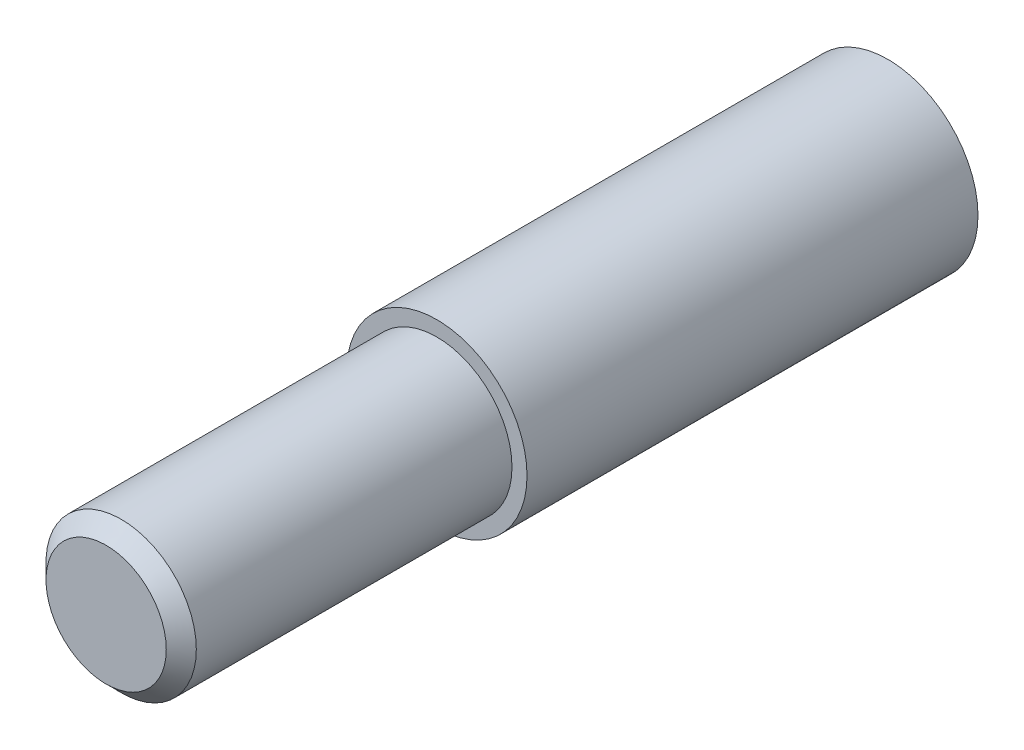
ISO-10303-21;
HEADER;
FILE_DESCRIPTION(('STEP AP214'),'2;1');
FILE_NAME('part.step','',(''),(''),'','','');
FILE_SCHEMA(('AUTOMOTIVE_DESIGN { 1 0 10303 214 1 1 1 1 }'));
ENDSEC;
DATA;
#1=APPLICATION_CONTEXT('core data for automotive mechanical design processes');
#2=APPLICATION_PROTOCOL_DEFINITION('international standard','automotive_design',2000,#1);
#3=PRODUCT_CONTEXT('',#1,'mechanical');
#4=PRODUCT('Part','Part','',(#3));
#5=PRODUCT_RELATED_PRODUCT_CATEGORY('part','',(#4));
#6=PRODUCT_DEFINITION_FORMATION('','',#4);
#7=PRODUCT_DEFINITION_CONTEXT('part definition',#1,'design');
#8=PRODUCT_DEFINITION('design','',#6,#7);
#9=PRODUCT_DEFINITION_SHAPE('','',#8);
#10=(LENGTH_UNIT() NAMED_UNIT(*) SI_UNIT(.MILLI.,.METRE.));
#11=(NAMED_UNIT(*) PLANE_ANGLE_UNIT() SI_UNIT($,.RADIAN.));
#12=(NAMED_UNIT(*) SI_UNIT($,.STERADIAN.) SOLID_ANGLE_UNIT());
#13=UNCERTAINTY_MEASURE_WITH_UNIT(LENGTH_MEASURE(1.E-05),#10,'distance_accuracy_value','');
#14=(GEOMETRIC_REPRESENTATION_CONTEXT(3) GLOBAL_UNCERTAINTY_ASSIGNED_CONTEXT((#13)) GLOBAL_UNIT_ASSIGNED_CONTEXT((#10,
#11,#12)) REPRESENTATION_CONTEXT('',''));
#15=CARTESIAN_POINT('',(0.,0.,0.));
#16=DIRECTION('',(0.,0.,1.));
#17=DIRECTION('',(1.,0.,0.));
#18=AXIS2_PLACEMENT_3D('',#15,#16,#17);
#19=CARTESIAN_POINT('',(0.,0.,30.));
#20=DIRECTION('',(0.,0.,1.));
#21=DIRECTION('',(1.,0.,0.));
#22=AXIS2_PLACEMENT_3D('',#19,#20,#21);
#23=PLANE('',#22);
#24=CARTESIAN_POINT('',(0.,0.,30.));
#25=DIRECTION('',(0.,0.,1.));
#26=DIRECTION('',(1.,0.,0.));
#27=AXIS2_PLACEMENT_3D('',#24,#25,#26);
#28=CIRCLE('',#27,6.);
#29=CARTESIAN_POINT('',(6.,0.,30.));
#30=VERTEX_POINT('',#29);
#31=EDGE_CURVE('E41',#30,#30,#28,.T.);
#32=ORIENTED_EDGE('',*,*,#31,.T.);
#33=EDGE_LOOP('',(#32));
#34=FACE_BOUND('',#33,.T.);
#35=CARTESIAN_POINT('',(0.,0.,30.));
#36=DIRECTION('',(0.,0.,1.));
#37=DIRECTION('',(1.,0.,0.));
#38=AXIS2_PLACEMENT_3D('',#35,#36,#37);
#39=CIRCLE('',#38,5.);
#40=CARTESIAN_POINT('',(5.,0.,30.));
#41=VERTEX_POINT('',#40);
#42=EDGE_CURVE('E49',#41,#41,#39,.T.);
#43=ORIENTED_EDGE('',*,*,#42,.F.);
#44=EDGE_LOOP('',(#43));
#45=FACE_BOUND('',#44,.T.);
#46=ADVANCED_FACE('F30',(#34,#45),#23,.T.);
#47=CARTESIAN_POINT('',(0.,0.,30.));
#48=DIRECTION('',(0.,0.,-1.));
#49=DIRECTION('',(-1.,0.,0.));
#50=AXIS2_PLACEMENT_3D('',#47,#48,#49);
#51=CYLINDRICAL_SURFACE('',#50,6.);
#52=ORIENTED_EDGE('',*,*,#31,.F.);
#53=EDGE_LOOP('',(#52));
#54=FACE_BOUND('',#53,.T.);
#55=CARTESIAN_POINT('',(0.,0.,0.));
#56=DIRECTION('',(0.,0.,1.));
#57=DIRECTION('',(1.,0.,0.));
#58=AXIS2_PLACEMENT_3D('',#55,#56,#57);
#59=CIRCLE('',#58,6.);
#60=CARTESIAN_POINT('',(6.,0.,0.));
#61=VERTEX_POINT('',#60);
#62=EDGE_CURVE('E45',#61,#61,#59,.T.);
#63=ORIENTED_EDGE('',*,*,#62,.T.);
#64=EDGE_LOOP('',(#63));
#65=FACE_BOUND('',#64,.T.);
#66=ADVANCED_FACE('F57',(#54,#65),#51,.T.);
#67=CARTESIAN_POINT('',(0.,0.,0.));
#68=DIRECTION('',(0.,0.,1.));
#69=DIRECTION('',(1.,0.,0.));
#70=AXIS2_PLACEMENT_3D('',#67,#68,#69);
#71=PLANE('',#70);
#72=ORIENTED_EDGE('',*,*,#62,.F.);
#73=EDGE_LOOP('',(#72));
#74=FACE_BOUND('',#73,.T.);
#75=ADVANCED_FACE('F63',(#74),#71,.F.);
#76=CARTESIAN_POINT('',(0.,0.,52.));
#77=DIRECTION('',(0.,0.,-1.));
#78=DIRECTION('',(-1.,0.,0.));
#79=AXIS2_PLACEMENT_3D('',#76,#77,#78);
#80=CYLINDRICAL_SURFACE('',#79,5.);
#81=CARTESIAN_POINT('',(0.,0.,51.));
#82=DIRECTION('',(0.,0.,1.));
#83=DIRECTION('',(1.,0.,0.));
#84=AXIS2_PLACEMENT_3D('',#81,#82,#83);
#85=CIRCLE('',#84,5.);
#86=CARTESIAN_POINT('',(5.,0.,51.));
#87=VERTEX_POINT('',#86);
#88=EDGE_CURVE('E10',#87,#87,#85,.F.);
#89=ORIENTED_EDGE('',*,*,#88,.T.);
#90=EDGE_LOOP('',(#89));
#91=FACE_BOUND('',#90,.T.);
#92=ORIENTED_EDGE('',*,*,#42,.T.);
#93=EDGE_LOOP('',(#92));
#94=FACE_BOUND('',#93,.T.);
#95=ADVANCED_FACE('F54',(#91,#94),#80,.T.);
#96=CARTESIAN_POINT('',(0.,0.,52.));
#97=DIRECTION('',(0.,0.,1.));
#98=DIRECTION('',(1.,0.,0.));
#99=AXIS2_PLACEMENT_3D('',#96,#97,#98);
#100=PLANE('',#99);
#101=CARTESIAN_POINT('',(0.,0.,52.));
#102=DIRECTION('',(0.,0.,1.));
#103=DIRECTION('',(1.,0.,0.));
#104=AXIS2_PLACEMENT_3D('',#101,#102,#103);
#105=CIRCLE('',#104,4.);
#106=CARTESIAN_POINT('',(4.,0.,52.));
#107=VERTEX_POINT('',#106);
#108=EDGE_CURVE('E37',#107,#107,#105,.T.);
#109=ORIENTED_EDGE('',*,*,#108,.T.);
#110=EDGE_LOOP('',(#109));
#111=FACE_BOUND('',#110,.T.);
#112=ADVANCED_FACE('F73',(#111),#100,.T.);
#113=CARTESIAN_POINT('',(0.,0.,52.));
#114=DIRECTION('',(0.,0.,-1.));
#115=DIRECTION('',(-1.,0.,0.));
#116=AXIS2_PLACEMENT_3D('',#113,#114,#115);
#117=CONICAL_SURFACE('',#116,4.,0.785398163397443);
#118=ORIENTED_EDGE('',*,*,#88,.F.);
#119=EDGE_LOOP('',(#118));
#120=FACE_BOUND('',#119,.T.);
#121=ORIENTED_EDGE('',*,*,#108,.F.);
#122=EDGE_LOOP('',(#121));
#123=FACE_BOUND('',#122,.T.);
#124=ADVANCED_FACE('F32',(#120,#123),#117,.T.);
#125=CLOSED_SHELL('',(#46,#66,#75,#95,#112,#124));
#126=MANIFOLD_SOLID_BREP('B2',#125);
#127=ADVANCED_BREP_SHAPE_REPRESENTATION('',(#18,#126),#14);
#128=SHAPE_DEFINITION_REPRESENTATION(#9,#127);
ENDSEC;
END-ISO-10303-21;
